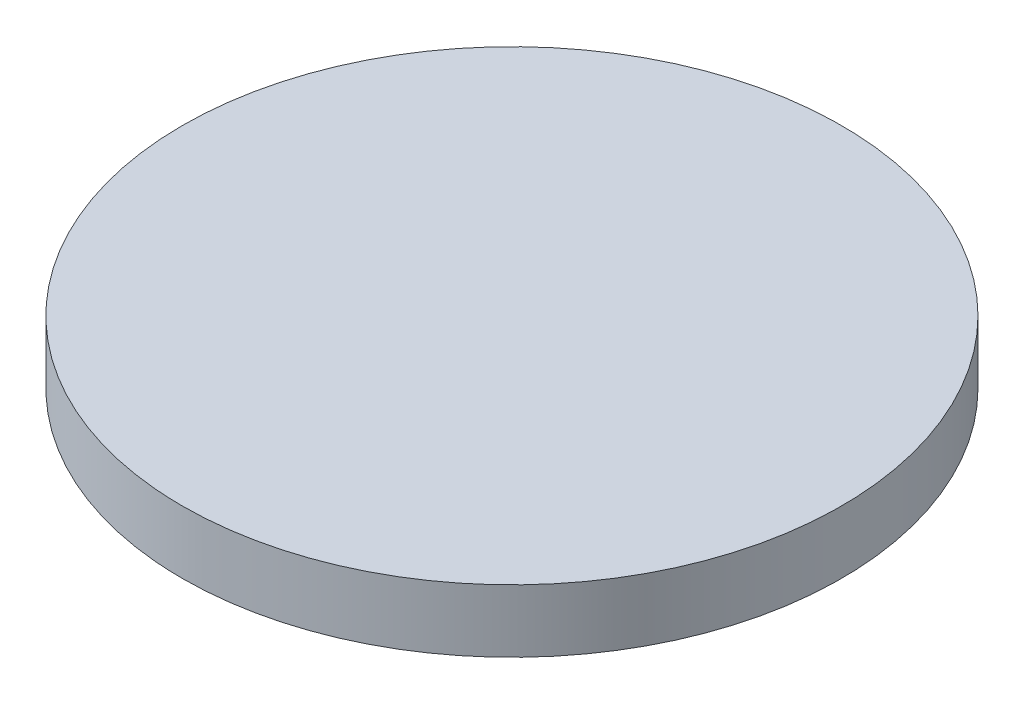
ISO-10303-21;
HEADER;
FILE_DESCRIPTION(('STEP AP214'),'2;1');
FILE_NAME('part.step','',(''),(''),'','','');
FILE_SCHEMA(('AUTOMOTIVE_DESIGN { 1 0 10303 214 1 1 1 1 }'));
ENDSEC;
DATA;
#1=APPLICATION_CONTEXT('core data for automotive mechanical design processes');
#2=APPLICATION_PROTOCOL_DEFINITION('international standard','automotive_design',2000,#1);
#3=PRODUCT_CONTEXT('',#1,'mechanical');
#4=PRODUCT('Part','Part','',(#3));
#5=PRODUCT_RELATED_PRODUCT_CATEGORY('part','',(#4));
#6=PRODUCT_DEFINITION_FORMATION('','',#4);
#7=PRODUCT_DEFINITION_CONTEXT('part definition',#1,'design');
#8=PRODUCT_DEFINITION('design','',#6,#7);
#9=PRODUCT_DEFINITION_SHAPE('','',#8);
#10=(LENGTH_UNIT() NAMED_UNIT(*) SI_UNIT(.MILLI.,.METRE.));
#11=(NAMED_UNIT(*) PLANE_ANGLE_UNIT() SI_UNIT($,.RADIAN.));
#12=(NAMED_UNIT(*) SI_UNIT($,.STERADIAN.) SOLID_ANGLE_UNIT());
#13=UNCERTAINTY_MEASURE_WITH_UNIT(LENGTH_MEASURE(1.E-05),#10,'distance_accuracy_value','');
#14=(GEOMETRIC_REPRESENTATION_CONTEXT(3) GLOBAL_UNCERTAINTY_ASSIGNED_CONTEXT((#13)) GLOBAL_UNIT_ASSIGNED_CONTEXT((#10,
#11,#12)) REPRESENTATION_CONTEXT('',''));
#15=CARTESIAN_POINT('',(0.,0.,0.));
#16=DIRECTION('',(0.,0.,1.));
#17=DIRECTION('',(1.,0.,0.));
#18=AXIS2_PLACEMENT_3D('',#15,#16,#17);
#19=CARTESIAN_POINT('',(0.,150.94635623731,0.));
#20=DIRECTION('',(0.,1.,0.));
#21=DIRECTION('',(0.,0.,1.));
#22=AXIS2_PLACEMENT_3D('',#19,#20,#21);
#23=ELLIPSE('',#22,50.,50.);
#24=DIRECTION('',(0.,-1.,0.));
#25=VECTOR('',#24,1.);
#26=SURFACE_OF_LINEAR_EXTRUSION('',#23,#25);
#27=CARTESIAN_POINT('',(0.,0.,0.));
#28=DIRECTION('',(0.,1.,0.));
#29=DIRECTION('',(0.,0.,1.));
#30=AXIS2_PLACEMENT_3D('',#27,#28,#29);
#31=ELLIPSE('',#30,50.,50.);
#32=CARTESIAN_POINT('',(0.,0.,50.));
#33=VERTEX_POINT('',#32);
#34=EDGE_CURVE('E39',#33,#33,#31,.T.);
#35=ORIENTED_EDGE('',*,*,#34,.T.);
#36=EDGE_LOOP('',(#35));
#37=FACE_BOUND('',#36,.T.);
#38=CARTESIAN_POINT('',(0.,9.52500000000001,0.));
#39=DIRECTION('',(0.,1.,0.));
#40=DIRECTION('',(0.,0.,1.));
#41=AXIS2_PLACEMENT_3D('',#38,#39,#40);
#42=ELLIPSE('',#41,50.,50.);
#43=CARTESIAN_POINT('',(0.,9.52500000000001,50.));
#44=VERTEX_POINT('',#43);
#45=EDGE_CURVE('E10',#44,#44,#42,.T.);
#46=ORIENTED_EDGE('',*,*,#45,.F.);
#47=EDGE_LOOP('',(#46));
#48=FACE_BOUND('',#47,.T.);
#49=ADVANCED_FACE('F31',(#37,#48),#26,.F.);
#50=CARTESIAN_POINT('',(0.,0.,0.));
#51=DIRECTION('',(0.,1.,0.));
#52=DIRECTION('',(0.,0.,1.));
#53=AXIS2_PLACEMENT_3D('',#50,#51,#52);
#54=PLANE('',#53);
#55=ORIENTED_EDGE('',*,*,#34,.F.);
#56=EDGE_LOOP('',(#55));
#57=FACE_BOUND('',#56,.T.);
#58=ADVANCED_FACE('F48',(#57),#54,.F.);
#59=CARTESIAN_POINT('',(0.,9.525,0.));
#60=DIRECTION('',(0.,1.,0.));
#61=DIRECTION('',(0.,0.,1.));
#62=AXIS2_PLACEMENT_3D('',#59,#60,#61);
#63=PLANE('',#62);
#64=ORIENTED_EDGE('',*,*,#45,.T.);
#65=EDGE_LOOP('',(#64));
#66=FACE_BOUND('',#65,.T.);
#67=ADVANCED_FACE('F33',(#66),#63,.T.);
#68=CLOSED_SHELL('',(#49,#58,#67));
#69=MANIFOLD_SOLID_BREP('B2',#68);
#70=ADVANCED_BREP_SHAPE_REPRESENTATION('',(#18,#69),#14);
#71=SHAPE_DEFINITION_REPRESENTATION(#9,#70);
ENDSEC;
END-ISO-10303-21;
